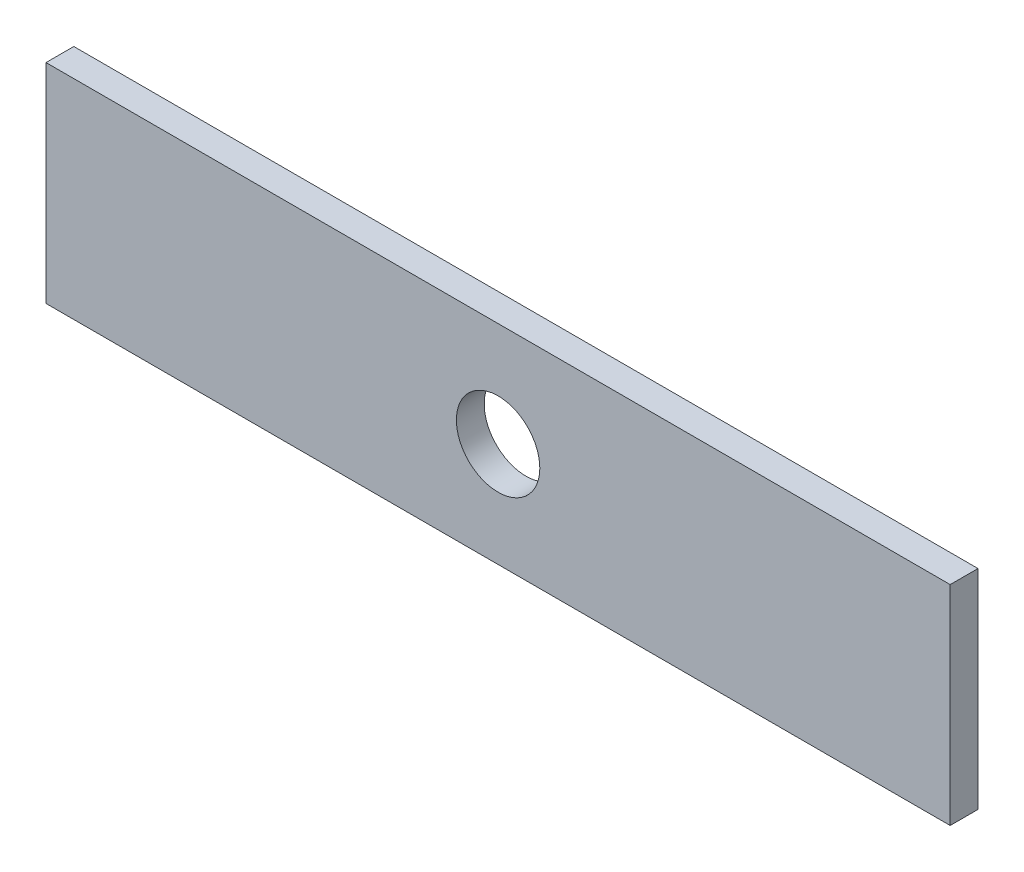
ISO-10303-21;
HEADER;
FILE_DESCRIPTION(('STEP AP214'),'2;1');
FILE_NAME('part.step','',(''),(''),'','','');
FILE_SCHEMA(('AUTOMOTIVE_DESIGN { 1 0 10303 214 1 1 1 1 }'));
ENDSEC;
DATA;
#1=APPLICATION_CONTEXT('core data for automotive mechanical design processes');
#2=APPLICATION_PROTOCOL_DEFINITION('international standard','automotive_design',2000,#1);
#3=PRODUCT_CONTEXT('',#1,'mechanical');
#4=PRODUCT('Part','Part','',(#3));
#5=PRODUCT_RELATED_PRODUCT_CATEGORY('part','',(#4));
#6=PRODUCT_DEFINITION_FORMATION('','',#4);
#7=PRODUCT_DEFINITION_CONTEXT('part definition',#1,'design');
#8=PRODUCT_DEFINITION('design','',#6,#7);
#9=PRODUCT_DEFINITION_SHAPE('','',#8);
#10=(LENGTH_UNIT() NAMED_UNIT(*) SI_UNIT(.MILLI.,.METRE.));
#11=(NAMED_UNIT(*) PLANE_ANGLE_UNIT() SI_UNIT($,.RADIAN.));
#12=(NAMED_UNIT(*) SI_UNIT($,.STERADIAN.) SOLID_ANGLE_UNIT());
#13=UNCERTAINTY_MEASURE_WITH_UNIT(LENGTH_MEASURE(1.E-05),#10,'distance_accuracy_value','');
#14=(GEOMETRIC_REPRESENTATION_CONTEXT(3) GLOBAL_UNCERTAINTY_ASSIGNED_CONTEXT((#13)) GLOBAL_UNIT_ASSIGNED_CONTEXT((#10,
#11,#12)) REPRESENTATION_CONTEXT('',''));
#15=CARTESIAN_POINT('',(0.,0.,0.));
#16=DIRECTION('',(0.,0.,1.));
#17=DIRECTION('',(1.,0.,0.));
#18=AXIS2_PLACEMENT_3D('',#15,#16,#17);
#19=CARTESIAN_POINT('',(0.,0.,2.));
#20=DIRECTION('',(0.,0.,1.));
#21=DIRECTION('',(1.,0.,0.));
#22=AXIS2_PLACEMENT_3D('',#19,#20,#21);
#23=PLANE('',#22);
#24=DIRECTION('',(0.,-1.,0.));
#25=VECTOR('',#24,1.);
#26=CARTESIAN_POINT('',(-30.0557402833924,16.0261707988981,2.));
#27=LINE('',#26,#25);
#28=CARTESIAN_POINT('',(-30.0557402833924,16.0261707988981,2.));
#29=VERTEX_POINT('',#28);
#30=CARTESIAN_POINT('',(-30.0557402833924,1.02617079889807,2.));
#31=VERTEX_POINT('',#30);
#32=EDGE_CURVE('E85',#29,#31,#27,.T.);
#33=ORIENTED_EDGE('',*,*,#32,.T.);
#34=DIRECTION('',(1.,0.,0.));
#35=VECTOR('',#34,1.);
#36=CARTESIAN_POINT('',(-30.0557402833924,1.02617079889807,2.));
#37=LINE('',#36,#35);
#38=CARTESIAN_POINT('',(34.9442597166076,1.02617079889807,2.));
#39=VERTEX_POINT('',#38);
#40=EDGE_CURVE('E80',#31,#39,#37,.T.);
#41=ORIENTED_EDGE('',*,*,#40,.T.);
#42=DIRECTION('',(0.,1.,0.));
#43=VECTOR('',#42,1.);
#44=CARTESIAN_POINT('',(34.9442597166076,16.0261707988981,2.));
#45=LINE('',#44,#43);
#46=CARTESIAN_POINT('',(34.9442597166076,16.0261707988981,2.));
#47=VERTEX_POINT('',#46);
#48=EDGE_CURVE('E83',#39,#47,#45,.T.);
#49=ORIENTED_EDGE('',*,*,#48,.T.);
#50=DIRECTION('',(-1.,0.,0.));
#51=VECTOR('',#50,1.);
#52=CARTESIAN_POINT('',(-30.0557402833924,16.0261707988981,2.));
#53=LINE('',#52,#51);
#54=EDGE_CURVE('E50',#47,#29,#53,.T.);
#55=ORIENTED_EDGE('',*,*,#54,.T.);
#56=EDGE_LOOP('',(#33,#41,#49,#55));
#57=FACE_BOUND('',#56,.T.);
#58=CARTESIAN_POINT('',(2.44425971660757,8.52617079889807,2.));
#59=DIRECTION('',(0.,0.,1.));
#60=DIRECTION('',(1.,0.,0.));
#61=AXIS2_PLACEMENT_3D('',#58,#59,#60);
#62=CIRCLE('',#61,3.);
#63=CARTESIAN_POINT('',(5.44425971660757,8.52617079889807,2.));
#64=VERTEX_POINT('',#63);
#65=EDGE_CURVE('E100',#64,#64,#62,.T.);
#66=ORIENTED_EDGE('',*,*,#65,.F.);
#67=EDGE_LOOP('',(#66));
#68=FACE_BOUND('',#67,.T.);
#69=ADVANCED_FACE('F33',(#57,#68),#23,.T.);
#70=CARTESIAN_POINT('',(0.,0.,0.));
#71=DIRECTION('',(0.,0.,1.));
#72=DIRECTION('',(1.,0.,0.));
#73=AXIS2_PLACEMENT_3D('',#70,#71,#72);
#74=PLANE('',#73);
#75=DIRECTION('',(0.,-1.,0.));
#76=VECTOR('',#75,1.);
#77=CARTESIAN_POINT('',(-30.0557402833924,16.0261707988981,0.));
#78=LINE('',#77,#76);
#79=CARTESIAN_POINT('',(-30.0557402833924,16.0261707988981,0.));
#80=VERTEX_POINT('',#79);
#81=CARTESIAN_POINT('',(-30.0557402833924,1.02617079889807,0.));
#82=VERTEX_POINT('',#81);
#83=EDGE_CURVE('E97',#80,#82,#78,.T.);
#84=ORIENTED_EDGE('',*,*,#83,.F.);
#85=DIRECTION('',(-1.,0.,0.));
#86=VECTOR('',#85,1.);
#87=CARTESIAN_POINT('',(-30.0557402833924,16.0261707988981,0.));
#88=LINE('',#87,#86);
#89=CARTESIAN_POINT('',(34.9442597166076,16.0261707988981,0.));
#90=VERTEX_POINT('',#89);
#91=EDGE_CURVE('E73',#90,#80,#88,.T.);
#92=ORIENTED_EDGE('',*,*,#91,.F.);
#93=DIRECTION('',(0.,1.,0.));
#94=VECTOR('',#93,1.);
#95=CARTESIAN_POINT('',(34.9442597166076,16.0261707988981,0.));
#96=LINE('',#95,#94);
#97=CARTESIAN_POINT('',(34.9442597166076,1.02617079889807,0.));
#98=VERTEX_POINT('',#97);
#99=EDGE_CURVE('E67',#98,#90,#96,.T.);
#100=ORIENTED_EDGE('',*,*,#99,.F.);
#101=DIRECTION('',(1.,0.,0.));
#102=VECTOR('',#101,1.);
#103=CARTESIAN_POINT('',(-30.0557402833924,1.02617079889807,0.));
#104=LINE('',#103,#102);
#105=EDGE_CURVE('E89',#82,#98,#104,.T.);
#106=ORIENTED_EDGE('',*,*,#105,.F.);
#107=EDGE_LOOP('',(#84,#92,#100,#106));
#108=FACE_BOUND('',#107,.T.);
#109=CARTESIAN_POINT('',(2.44425971660757,8.52617079889807,0.));
#110=DIRECTION('',(0.,0.,1.));
#111=DIRECTION('',(1.,0.,0.));
#112=AXIS2_PLACEMENT_3D('',#109,#110,#111);
#113=CIRCLE('',#112,3.);
#114=CARTESIAN_POINT('',(5.44425971660757,8.52617079889807,0.));
#115=VERTEX_POINT('',#114);
#116=EDGE_CURVE('E112',#115,#115,#113,.T.);
#117=ORIENTED_EDGE('',*,*,#116,.T.);
#118=EDGE_LOOP('',(#117));
#119=FACE_BOUND('',#118,.T.);
#120=ADVANCED_FACE('F108',(#108,#119),#74,.F.);
#121=CARTESIAN_POINT('',(-30.0557402833924,16.0261707988981,2.));
#122=DIRECTION('',(1.,0.,0.));
#123=DIRECTION('',(0.,1.,0.));
#124=AXIS2_PLACEMENT_3D('',#121,#122,#123);
#125=PLANE('',#124);
#126=ORIENTED_EDGE('',*,*,#83,.T.);
#127=DIRECTION('',(0.,0.,-1.));
#128=VECTOR('',#127,1.);
#129=CARTESIAN_POINT('',(-30.0557402833924,1.02617079889807,2.));
#130=LINE('',#129,#128);
#131=EDGE_CURVE('E11',#31,#82,#130,.T.);
#132=ORIENTED_EDGE('',*,*,#131,.F.);
#133=ORIENTED_EDGE('',*,*,#32,.F.);
#134=DIRECTION('',(0.,0.,-1.));
#135=VECTOR('',#134,1.);
#136=CARTESIAN_POINT('',(-30.0557402833924,16.0261707988981,2.));
#137=LINE('',#136,#135);
#138=EDGE_CURVE('E93',#29,#80,#137,.T.);
#139=ORIENTED_EDGE('',*,*,#138,.T.);
#140=EDGE_LOOP('',(#126,#132,#133,#139));
#141=FACE_BOUND('',#140,.T.);
#142=ADVANCED_FACE('F35',(#141),#125,.F.);
#143=CARTESIAN_POINT('',(-30.0557402833924,1.02617079889807,2.));
#144=DIRECTION('',(0.,1.,0.));
#145=DIRECTION('',(0.,0.,1.));
#146=AXIS2_PLACEMENT_3D('',#143,#144,#145);
#147=PLANE('',#146);
#148=ORIENTED_EDGE('',*,*,#105,.T.);
#149=DIRECTION('',(0.,0.,-1.));
#150=VECTOR('',#149,1.);
#151=CARTESIAN_POINT('',(34.9442597166076,1.02617079889807,2.));
#152=LINE('',#151,#150);
#153=EDGE_CURVE('E42',#39,#98,#152,.T.);
#154=ORIENTED_EDGE('',*,*,#153,.F.);
#155=ORIENTED_EDGE('',*,*,#40,.F.);
#156=ORIENTED_EDGE('',*,*,#131,.T.);
#157=EDGE_LOOP('',(#148,#154,#155,#156));
#158=FACE_BOUND('',#157,.T.);
#159=ADVANCED_FACE('F88',(#158),#147,.F.);
#160=CARTESIAN_POINT('',(34.9442597166076,16.0261707988981,2.));
#161=DIRECTION('',(-1.,0.,0.));
#162=DIRECTION('',(0.,0.,1.));
#163=AXIS2_PLACEMENT_3D('',#160,#161,#162);
#164=PLANE('',#163);
#165=ORIENTED_EDGE('',*,*,#99,.T.);
#166=DIRECTION('',(0.,0.,-1.));
#167=VECTOR('',#166,1.);
#168=CARTESIAN_POINT('',(34.9442597166076,16.0261707988981,2.));
#169=LINE('',#168,#167);
#170=EDGE_CURVE('E90',#47,#90,#169,.T.);
#171=ORIENTED_EDGE('',*,*,#170,.F.);
#172=ORIENTED_EDGE('',*,*,#48,.F.);
#173=ORIENTED_EDGE('',*,*,#153,.T.);
#174=EDGE_LOOP('',(#165,#171,#172,#173));
#175=FACE_BOUND('',#174,.T.);
#176=ADVANCED_FACE('F91',(#175),#164,.F.);
#177=CARTESIAN_POINT('',(-30.0557402833924,16.0261707988981,2.));
#178=DIRECTION('',(0.,-1.,0.));
#179=DIRECTION('',(0.,0.,-1.));
#180=AXIS2_PLACEMENT_3D('',#177,#178,#179);
#181=PLANE('',#180);
#182=ORIENTED_EDGE('',*,*,#91,.T.);
#183=ORIENTED_EDGE('',*,*,#138,.F.);
#184=ORIENTED_EDGE('',*,*,#54,.F.);
#185=ORIENTED_EDGE('',*,*,#170,.T.);
#186=EDGE_LOOP('',(#182,#183,#184,#185));
#187=FACE_BOUND('',#186,.T.);
#188=ADVANCED_FACE('F105',(#187),#181,.F.);
#189=CARTESIAN_POINT('',(2.44425971660757,8.52617079889807,2.));
#190=DIRECTION('',(0.,0.,-1.));
#191=DIRECTION('',(-1.,0.,0.));
#192=AXIS2_PLACEMENT_3D('',#189,#190,#191);
#193=CYLINDRICAL_SURFACE('',#192,3.);
#194=ORIENTED_EDGE('',*,*,#65,.T.);
#195=EDGE_LOOP('',(#194));
#196=FACE_BOUND('',#195,.T.);
#197=ORIENTED_EDGE('',*,*,#116,.F.);
#198=EDGE_LOOP('',(#197));
#199=FACE_BOUND('',#198,.T.);
#200=ADVANCED_FACE('F118',(#196,#199),#193,.F.);
#201=CLOSED_SHELL('',(#69,#120,#142,#159,#176,#188,#200));
#202=MANIFOLD_SOLID_BREP('B2',#201);
#203=ADVANCED_BREP_SHAPE_REPRESENTATION('',(#18,#202),#14);
#204=SHAPE_DEFINITION_REPRESENTATION(#9,#203);
ENDSEC;
END-ISO-10303-21;
